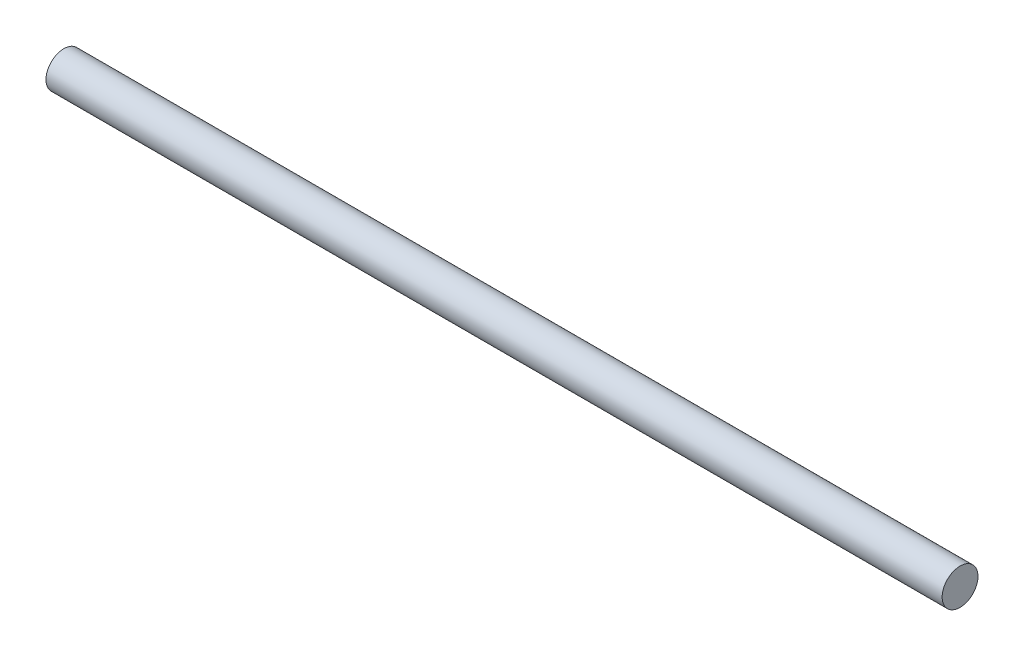
ISO-10303-21;
HEADER;
FILE_DESCRIPTION(('STEP AP214'),'2;1');
FILE_NAME('part.step','',(''),(''),'','','');
FILE_SCHEMA(('AUTOMOTIVE_DESIGN { 1 0 10303 214 1 1 1 1 }'));
ENDSEC;
DATA;
#1=APPLICATION_CONTEXT('core data for automotive mechanical design processes');
#2=APPLICATION_PROTOCOL_DEFINITION('international standard','automotive_design',2000,#1);
#3=PRODUCT_CONTEXT('',#1,'mechanical');
#4=PRODUCT('Part','Part','',(#3));
#5=PRODUCT_RELATED_PRODUCT_CATEGORY('part','',(#4));
#6=PRODUCT_DEFINITION_FORMATION('','',#4);
#7=PRODUCT_DEFINITION_CONTEXT('part definition',#1,'design');
#8=PRODUCT_DEFINITION('design','',#6,#7);
#9=PRODUCT_DEFINITION_SHAPE('','',#8);
#10=(LENGTH_UNIT() NAMED_UNIT(*) SI_UNIT(.MILLI.,.METRE.));
#11=(NAMED_UNIT(*) PLANE_ANGLE_UNIT() SI_UNIT($,.RADIAN.));
#12=(NAMED_UNIT(*) SI_UNIT($,.STERADIAN.) SOLID_ANGLE_UNIT());
#13=UNCERTAINTY_MEASURE_WITH_UNIT(LENGTH_MEASURE(1.E-05),#10,'distance_accuracy_value','');
#14=(GEOMETRIC_REPRESENTATION_CONTEXT(3) GLOBAL_UNCERTAINTY_ASSIGNED_CONTEXT((#13)) GLOBAL_UNIT_ASSIGNED_CONTEXT((#10,
#11,#12)) REPRESENTATION_CONTEXT('',''));
#15=CARTESIAN_POINT('',(0.,0.,0.));
#16=DIRECTION('',(0.,0.,1.));
#17=DIRECTION('',(1.,0.,0.));
#18=AXIS2_PLACEMENT_3D('',#15,#16,#17);
#19=CARTESIAN_POINT('',(177.8,0.,0.));
#20=DIRECTION('',(-1.,0.,0.));
#21=DIRECTION('',(0.,0.,1.));
#22=AXIS2_PLACEMENT_3D('',#19,#20,#21);
#23=CYLINDRICAL_SURFACE('',#22,3.556);
#24=CARTESIAN_POINT('',(177.8,0.,0.));
#25=DIRECTION('',(1.,0.,0.));
#26=DIRECTION('',(0.,0.,-1.));
#27=AXIS2_PLACEMENT_3D('',#24,#25,#26);
#28=CIRCLE('',#27,3.556);
#29=CARTESIAN_POINT('',(177.8,0.,-3.556));
#30=VERTEX_POINT('',#29);
#31=EDGE_CURVE('E10',#30,#30,#28,.T.);
#32=ORIENTED_EDGE('',*,*,#31,.F.);
#33=EDGE_LOOP('',(#32));
#34=FACE_BOUND('',#33,.T.);
#35=CARTESIAN_POINT('',(0.,0.,0.));
#36=DIRECTION('',(1.,0.,0.));
#37=DIRECTION('',(0.,0.,-1.));
#38=AXIS2_PLACEMENT_3D('',#35,#36,#37);
#39=CIRCLE('',#38,3.556);
#40=CARTESIAN_POINT('',(0.,0.,-3.556));
#41=VERTEX_POINT('',#40);
#42=EDGE_CURVE('E34',#41,#41,#39,.T.);
#43=ORIENTED_EDGE('',*,*,#42,.T.);
#44=EDGE_LOOP('',(#43));
#45=FACE_BOUND('',#44,.T.);
#46=ADVANCED_FACE('F31',(#34,#45),#23,.T.);
#47=CARTESIAN_POINT('',(177.8,0.,0.));
#48=DIRECTION('',(1.,0.,0.));
#49=DIRECTION('',(0.,0.,-1.));
#50=AXIS2_PLACEMENT_3D('',#47,#48,#49);
#51=PLANE('',#50);
#52=ORIENTED_EDGE('',*,*,#31,.T.);
#53=EDGE_LOOP('',(#52));
#54=FACE_BOUND('',#53,.T.);
#55=ADVANCED_FACE('F46',(#54),#51,.T.);
#56=CARTESIAN_POINT('',(0.,0.,0.));
#57=DIRECTION('',(1.,0.,0.));
#58=DIRECTION('',(0.,0.,-1.));
#59=AXIS2_PLACEMENT_3D('',#56,#57,#58);
#60=PLANE('',#59);
#61=ORIENTED_EDGE('',*,*,#42,.F.);
#62=EDGE_LOOP('',(#61));
#63=FACE_BOUND('',#62,.T.);
#64=ADVANCED_FACE('F44',(#63),#60,.F.);
#65=CLOSED_SHELL('',(#46,#55,#64));
#66=MANIFOLD_SOLID_BREP('B2',#65);
#67=ADVANCED_BREP_SHAPE_REPRESENTATION('',(#18,#66),#14);
#68=SHAPE_DEFINITION_REPRESENTATION(#9,#67);
ENDSEC;
END-ISO-10303-21;
